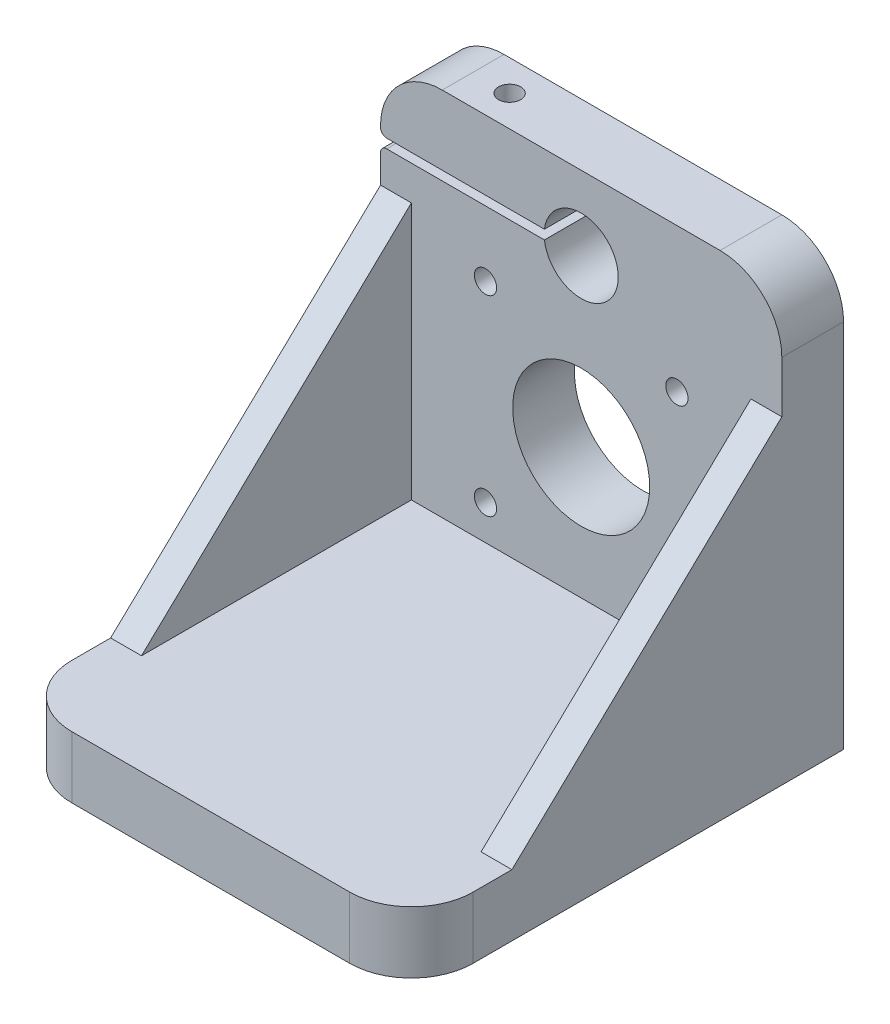
ISO-10303-21;
HEADER;
FILE_DESCRIPTION(('STEP AP214'),'2;1');
FILE_NAME('part.step','',(''),(''),'','','');
FILE_SCHEMA(('AUTOMOTIVE_DESIGN { 1 0 10303 214 1 1 1 1 }'));
ENDSEC;
DATA;
#1=APPLICATION_CONTEXT('core data for automotive mechanical design processes');
#2=APPLICATION_PROTOCOL_DEFINITION('international standard','automotive_design',2000,#1);
#3=PRODUCT_CONTEXT('',#1,'mechanical');
#4=PRODUCT('Part','Part','',(#3));
#5=PRODUCT_RELATED_PRODUCT_CATEGORY('part','',(#4));
#6=PRODUCT_DEFINITION_FORMATION('','',#4);
#7=PRODUCT_DEFINITION_CONTEXT('part definition',#1,'design');
#8=PRODUCT_DEFINITION('design','',#6,#7);
#9=PRODUCT_DEFINITION_SHAPE('','',#8);
#10=(LENGTH_UNIT() NAMED_UNIT(*) SI_UNIT(.MILLI.,.METRE.));
#11=(NAMED_UNIT(*) PLANE_ANGLE_UNIT() SI_UNIT($,.RADIAN.));
#12=(NAMED_UNIT(*) SI_UNIT($,.STERADIAN.) SOLID_ANGLE_UNIT());
#13=UNCERTAINTY_MEASURE_WITH_UNIT(LENGTH_MEASURE(1.E-05),#10,'distance_accuracy_value','');
#14=(GEOMETRIC_REPRESENTATION_CONTEXT(3) GLOBAL_UNCERTAINTY_ASSIGNED_CONTEXT((#13)) GLOBAL_UNIT_ASSIGNED_CONTEXT((#10,
#11,#12)) REPRESENTATION_CONTEXT('',''));
#15=CARTESIAN_POINT('',(0.,0.,0.));
#16=DIRECTION('',(0.,0.,1.));
#17=DIRECTION('',(1.,0.,0.));
#18=AXIS2_PLACEMENT_3D('',#15,#16,#17);
#19=CARTESIAN_POINT('',(-15.5,46.65,-35.));
#20=DIRECTION('',(0.,0.,1.));
#21=DIRECTION('',(1.,0.,0.));
#22=AXIS2_PLACEMENT_3D('',#19,#20,#21);
#23=CYLINDRICAL_SURFACE('',#22,1.8);
#24=CARTESIAN_POINT('',(-15.5,46.65,-25.));
#25=DIRECTION('',(0.,0.,1.));
#26=DIRECTION('',(1.,0.,0.));
#27=AXIS2_PLACEMENT_3D('',#24,#25,#26);
#28=CIRCLE('',#27,1.8);
#29=CARTESIAN_POINT('',(-13.7,46.65,-25.));
#30=VERTEX_POINT('',#29);
#31=EDGE_CURVE('E360',#30,#30,#28,.T.);
#32=ORIENTED_EDGE('',*,*,#31,.T.);
#33=EDGE_LOOP('',(#32));
#34=FACE_BOUND('',#33,.T.);
#35=CARTESIAN_POINT('',(-15.5,46.65,-30.));
#36=DIRECTION('',(0.,0.,-1.));
#37=DIRECTION('',(-1.,0.,0.));
#38=AXIS2_PLACEMENT_3D('',#35,#36,#37);
#39=CIRCLE('',#38,1.8);
#40=CARTESIAN_POINT('',(-17.3,46.65,-30.));
#41=VERTEX_POINT('',#40);
#42=EDGE_CURVE('E42',#41,#41,#39,.F.);
#43=ORIENTED_EDGE('',*,*,#42,.F.);
#44=EDGE_LOOP('',(#43));
#45=FACE_BOUND('',#44,.T.);
#46=ADVANCED_FACE('F38',(#34,#45),#23,.F.);
#47=CARTESIAN_POINT('',(15.5,15.65,-35.));
#48=DIRECTION('',(0.,0.,1.));
#49=DIRECTION('',(1.,0.,0.));
#50=AXIS2_PLACEMENT_3D('',#47,#48,#49);
#51=CYLINDRICAL_SURFACE('',#50,1.8);
#52=CARTESIAN_POINT('',(15.5,15.65,-25.));
#53=DIRECTION('',(0.,0.,1.));
#54=DIRECTION('',(1.,0.,0.));
#55=AXIS2_PLACEMENT_3D('',#52,#53,#54);
#56=CIRCLE('',#55,1.8);
#57=CARTESIAN_POINT('',(17.3,15.65,-25.));
#58=VERTEX_POINT('',#57);
#59=EDGE_CURVE('E344',#58,#58,#56,.T.);
#60=ORIENTED_EDGE('',*,*,#59,.T.);
#61=EDGE_LOOP('',(#60));
#62=FACE_BOUND('',#61,.T.);
#63=CARTESIAN_POINT('',(15.5,15.65,-30.));
#64=DIRECTION('',(0.,0.,-1.));
#65=DIRECTION('',(-1.,0.,0.));
#66=AXIS2_PLACEMENT_3D('',#63,#64,#65);
#67=CIRCLE('',#66,1.8);
#68=CARTESIAN_POINT('',(13.7,15.65,-30.));
#69=VERTEX_POINT('',#68);
#70=EDGE_CURVE('E339',#69,#69,#67,.F.);
#71=ORIENTED_EDGE('',*,*,#70,.F.);
#72=EDGE_LOOP('',(#71));
#73=FACE_BOUND('',#72,.T.);
#74=ADVANCED_FACE('F467',(#62,#73),#51,.F.);
#75=CARTESIAN_POINT('',(-15.5,15.65,-35.));
#76=DIRECTION('',(0.,0.,1.));
#77=DIRECTION('',(1.,0.,0.));
#78=AXIS2_PLACEMENT_3D('',#75,#76,#77);
#79=CYLINDRICAL_SURFACE('',#78,1.8);
#80=CARTESIAN_POINT('',(-15.5,15.65,-25.));
#81=DIRECTION('',(0.,0.,1.));
#82=DIRECTION('',(1.,0.,0.));
#83=AXIS2_PLACEMENT_3D('',#80,#81,#82);
#84=CIRCLE('',#83,1.8);
#85=CARTESIAN_POINT('',(-13.7,15.65,-25.));
#86=VERTEX_POINT('',#85);
#87=EDGE_CURVE('E348',#86,#86,#84,.T.);
#88=ORIENTED_EDGE('',*,*,#87,.T.);
#89=EDGE_LOOP('',(#88));
#90=FACE_BOUND('',#89,.T.);
#91=CARTESIAN_POINT('',(-15.5,15.65,-30.));
#92=DIRECTION('',(0.,0.,-1.));
#93=DIRECTION('',(-1.,0.,0.));
#94=AXIS2_PLACEMENT_3D('',#91,#92,#93);
#95=CIRCLE('',#94,1.8);
#96=CARTESIAN_POINT('',(-17.3,15.65,-30.));
#97=VERTEX_POINT('',#96);
#98=EDGE_CURVE('E336',#97,#97,#95,.F.);
#99=ORIENTED_EDGE('',*,*,#98,.F.);
#100=EDGE_LOOP('',(#99));
#101=FACE_BOUND('',#100,.T.);
#102=ADVANCED_FACE('F474',(#90,#101),#79,.F.);
#103=CARTESIAN_POINT('',(15.5,46.65,-35.));
#104=DIRECTION('',(0.,0.,1.));
#105=DIRECTION('',(1.,0.,0.));
#106=AXIS2_PLACEMENT_3D('',#103,#104,#105);
#107=CYLINDRICAL_SURFACE('',#106,1.8);
#108=CARTESIAN_POINT('',(15.5,46.65,-25.));
#109=DIRECTION('',(0.,0.,1.));
#110=DIRECTION('',(1.,0.,0.));
#111=AXIS2_PLACEMENT_3D('',#108,#109,#110);
#112=CIRCLE('',#111,1.8);
#113=CARTESIAN_POINT('',(17.3,46.65,-25.));
#114=VERTEX_POINT('',#113);
#115=EDGE_CURVE('E353',#114,#114,#112,.T.);
#116=ORIENTED_EDGE('',*,*,#115,.T.);
#117=EDGE_LOOP('',(#116));
#118=FACE_BOUND('',#117,.T.);
#119=CARTESIAN_POINT('',(15.5,46.65,-30.));
#120=DIRECTION('',(0.,0.,-1.));
#121=DIRECTION('',(-1.,0.,0.));
#122=AXIS2_PLACEMENT_3D('',#119,#120,#121);
#123=CIRCLE('',#122,1.8);
#124=CARTESIAN_POINT('',(13.7,46.65,-30.));
#125=VERTEX_POINT('',#124);
#126=EDGE_CURVE('E333',#125,#125,#123,.F.);
#127=ORIENTED_EDGE('',*,*,#126,.F.);
#128=EDGE_LOOP('',(#127));
#129=FACE_BOUND('',#128,.T.);
#130=ADVANCED_FACE('F694',(#118,#129),#107,.F.);
#131=CARTESIAN_POINT('',(-32.5,10.,-35.));
#132=DIRECTION('',(1.,0.,0.));
#133=DIRECTION('',(0.,0.,-1.));
#134=AXIS2_PLACEMENT_3D('',#131,#132,#133);
#135=PLANE('',#134);
#136=DIRECTION('',(0.,0.,1.));
#137=VECTOR('',#136,1.);
#138=CARTESIAN_POINT('',(-32.5,60.,-35.));
#139=LINE('',#138,#137);
#140=CARTESIAN_POINT('',(-32.5,60.,-25.));
#141=VERTEX_POINT('',#140);
#142=CARTESIAN_POINT('',(-32.5,60.,-35.));
#143=VERTEX_POINT('',#142);
#144=EDGE_CURVE('E312',#141,#143,#139,.F.);
#145=ORIENTED_EDGE('',*,*,#144,.T.);
#146=DIRECTION('',(0.,-1.,0.));
#147=VECTOR('',#146,1.);
#148=CARTESIAN_POINT('',(-32.5,10.,-35.));
#149=LINE('',#148,#147);
#150=CARTESIAN_POINT('',(-32.5,59.75,-35.));
#151=VERTEX_POINT('',#150);
#152=EDGE_CURVE('E273',#143,#151,#149,.T.);
#153=ORIENTED_EDGE('',*,*,#152,.T.);
#154=DIRECTION('',(0.,0.,1.));
#155=VECTOR('',#154,1.);
#156=CARTESIAN_POINT('',(-32.5,59.75,-35.));
#157=LINE('',#156,#155);
#158=CARTESIAN_POINT('',(-32.5,59.75,-25.));
#159=VERTEX_POINT('',#158);
#160=EDGE_CURVE('E314',#151,#159,#157,.T.);
#161=ORIENTED_EDGE('',*,*,#160,.T.);
#162=DIRECTION('',(0.,-1.,0.));
#163=VECTOR('',#162,1.);
#164=CARTESIAN_POINT('',(-32.5,70.,-25.));
#165=LINE('',#164,#163);
#166=EDGE_CURVE('E251',#141,#159,#165,.T.);
#167=ORIENTED_EDGE('',*,*,#166,.F.);
#168=EDGE_LOOP('',(#145,#153,#161,#167));
#169=FACE_BOUND('',#168,.T.);
#170=ADVANCED_FACE('F431',(#169),#135,.F.);
#171=CARTESIAN_POINT('',(0.,10.,0.));
#172=DIRECTION('',(0.,-1.,0.));
#173=DIRECTION('',(0.,0.,-1.));
#174=AXIS2_PLACEMENT_3D('',#171,#172,#173);
#175=PLANE('',#174);
#176=DIRECTION('',(0.,0.,1.));
#177=VECTOR('',#176,1.);
#178=CARTESIAN_POINT('',(32.5,10.,-35.));
#179=LINE('',#178,#177);
#180=CARTESIAN_POINT('',(32.5,10.,18.7176431970407));
#181=VERTEX_POINT('',#180);
#182=CARTESIAN_POINT('',(32.5,10.,25.));
#183=VERTEX_POINT('',#182);
#184=EDGE_CURVE('E60',#181,#183,#179,.T.);
#185=ORIENTED_EDGE('',*,*,#184,.F.);
#186=DIRECTION('',(-1.,0.,0.));
#187=VECTOR('',#186,1.);
#188=CARTESIAN_POINT('',(0.,10.,18.7176431970407));
#189=LINE('',#188,#187);
#190=CARTESIAN_POINT('',(27.5,10.,18.7176431970407));
#191=VERTEX_POINT('',#190);
#192=EDGE_CURVE('E55',#181,#191,#189,.T.);
#193=ORIENTED_EDGE('',*,*,#192,.T.);
#194=DIRECTION('',(0.,0.,1.));
#195=VECTOR('',#194,1.);
#196=CARTESIAN_POINT('',(27.5,10.,0.));
#197=LINE('',#196,#195);
#198=CARTESIAN_POINT('',(27.5,10.,-25.));
#199=VERTEX_POINT('',#198);
#200=EDGE_CURVE('E184',#199,#191,#197,.T.);
#201=ORIENTED_EDGE('',*,*,#200,.F.);
#202=DIRECTION('',(1.,0.,0.));
#203=VECTOR('',#202,1.);
#204=CARTESIAN_POINT('',(-32.5,10.,-25.));
#205=LINE('',#204,#203);
#206=CARTESIAN_POINT('',(-27.5,10.,-25.));
#207=VERTEX_POINT('',#206);
#208=EDGE_CURVE('E175',#207,#199,#205,.T.);
#209=ORIENTED_EDGE('',*,*,#208,.F.);
#210=DIRECTION('',(0.,0.,-1.));
#211=VECTOR('',#210,1.);
#212=CARTESIAN_POINT('',(-27.5,10.,0.));
#213=LINE('',#212,#211);
#214=CARTESIAN_POINT('',(-27.5,10.,18.7176431970407));
#215=VERTEX_POINT('',#214);
#216=EDGE_CURVE('E216',#215,#207,#213,.T.);
#217=ORIENTED_EDGE('',*,*,#216,.F.);
#218=DIRECTION('',(1.,0.,0.));
#219=VECTOR('',#218,1.);
#220=CARTESIAN_POINT('',(0.,10.,18.7176431970407));
#221=LINE('',#220,#219);
#222=CARTESIAN_POINT('',(-32.5,10.,18.7176431970407));
#223=VERTEX_POINT('',#222);
#224=EDGE_CURVE('E213',#215,#223,#221,.F.);
#225=ORIENTED_EDGE('',*,*,#224,.T.);
#226=DIRECTION('',(0.,0.,1.));
#227=VECTOR('',#226,1.);
#228=CARTESIAN_POINT('',(-32.5,10.,-35.));
#229=LINE('',#228,#227);
#230=CARTESIAN_POINT('',(-32.5,10.,25.));
#231=VERTEX_POINT('',#230);
#232=EDGE_CURVE('E260',#223,#231,#229,.T.);
#233=ORIENTED_EDGE('',*,*,#232,.T.);
#234=CARTESIAN_POINT('',(-22.5,10.,25.));
#235=DIRECTION('',(0.,-1.,0.));
#236=DIRECTION('',(0.,0.,-1.));
#237=AXIS2_PLACEMENT_3D('',#234,#235,#236);
#238=CIRCLE('',#237,10.);
#239=CARTESIAN_POINT('',(-22.5,10.,35.));
#240=VERTEX_POINT('',#239);
#241=EDGE_CURVE('E290',#231,#240,#238,.F.);
#242=ORIENTED_EDGE('',*,*,#241,.T.);
#243=DIRECTION('',(1.,0.,0.));
#244=VECTOR('',#243,1.);
#245=CARTESIAN_POINT('',(-32.5,10.,35.));
#246=LINE('',#245,#244);
#247=CARTESIAN_POINT('',(22.5,10.,35.));
#248=VERTEX_POINT('',#247);
#249=EDGE_CURVE('E255',#240,#248,#246,.T.);
#250=ORIENTED_EDGE('',*,*,#249,.T.);
#251=CARTESIAN_POINT('',(22.5,10.,25.));
#252=DIRECTION('',(0.,-1.,0.));
#253=DIRECTION('',(0.,0.,-1.));
#254=AXIS2_PLACEMENT_3D('',#251,#252,#253);
#255=CIRCLE('',#254,10.);
#256=EDGE_CURVE('E292',#248,#183,#255,.F.);
#257=ORIENTED_EDGE('',*,*,#256,.T.);
#258=EDGE_LOOP('',(#185,#193,#201,#209,#217,#225,#233,#242,#250,#257));
#259=FACE_BOUND('',#258,.T.);
#260=ADVANCED_FACE('F185',(#259),#175,.F.);
#261=CARTESIAN_POINT('',(-32.5,10.,35.));
#262=DIRECTION('',(0.,0.,-1.));
#263=DIRECTION('',(-1.,0.,0.));
#264=AXIS2_PLACEMENT_3D('',#261,#262,#263);
#265=PLANE('',#264);
#266=DIRECTION('',(1.,0.,0.));
#267=VECTOR('',#266,1.);
#268=CARTESIAN_POINT('',(-32.5,0.,35.));
#269=LINE('',#268,#267);
#270=CARTESIAN_POINT('',(-22.5,0.,35.));
#271=VERTEX_POINT('',#270);
#272=CARTESIAN_POINT('',(22.5,0.,35.));
#273=VERTEX_POINT('',#272);
#274=EDGE_CURVE('E254',#271,#273,#269,.T.);
#275=ORIENTED_EDGE('',*,*,#274,.T.);
#276=DIRECTION('',(0.,-1.,0.));
#277=VECTOR('',#276,1.);
#278=CARTESIAN_POINT('',(22.5,10.,35.));
#279=LINE('',#278,#277);
#280=EDGE_CURVE('E288',#273,#248,#279,.F.);
#281=ORIENTED_EDGE('',*,*,#280,.T.);
#282=ORIENTED_EDGE('',*,*,#249,.F.);
#283=DIRECTION('',(0.,-1.,0.));
#284=VECTOR('',#283,1.);
#285=CARTESIAN_POINT('',(-22.5,10.,35.));
#286=LINE('',#285,#284);
#287=EDGE_CURVE('E285',#240,#271,#286,.T.);
#288=ORIENTED_EDGE('',*,*,#287,.T.);
#289=EDGE_LOOP('',(#275,#281,#282,#288));
#290=FACE_BOUND('',#289,.T.);
#291=ADVANCED_FACE('F454',(#290),#265,.F.);
#292=CARTESIAN_POINT('',(32.5,10.,-35.));
#293=DIRECTION('',(1.,0.,0.));
#294=DIRECTION('',(0.,0.,-1.));
#295=AXIS2_PLACEMENT_3D('',#292,#293,#294);
#296=PLANE('',#295);
#297=DIRECTION('',(0.,-0.689915950609972,0.723889481270407));
#298=VECTOR('',#297,1.);
#299=CARTESIAN_POINT('',(32.5,51.6658898148117,-25.));
#300=LINE('',#299,#298);
#301=CARTESIAN_POINT('',(32.5,51.6658898148117,-25.));
#302=VERTEX_POINT('',#301);
#303=EDGE_CURVE('E194',#302,#181,#300,.T.);
#304=ORIENTED_EDGE('',*,*,#303,.T.);
#305=ORIENTED_EDGE('',*,*,#184,.T.);
#306=DIRECTION('',(0.,-1.,0.));
#307=VECTOR('',#306,1.);
#308=CARTESIAN_POINT('',(32.5,0.,25.));
#309=LINE('',#308,#307);
#310=CARTESIAN_POINT('',(32.5,0.,25.));
#311=VERTEX_POINT('',#310);
#312=EDGE_CURVE('E279',#183,#311,#309,.T.);
#313=ORIENTED_EDGE('',*,*,#312,.T.);
#314=DIRECTION('',(0.,0.,1.));
#315=VECTOR('',#314,1.);
#316=CARTESIAN_POINT('',(32.5,0.,-35.));
#317=LINE('',#316,#315);
#318=CARTESIAN_POINT('',(32.5,0.,-35.));
#319=VERTEX_POINT('',#318);
#320=EDGE_CURVE('E266',#319,#311,#317,.T.);
#321=ORIENTED_EDGE('',*,*,#320,.F.);
#322=DIRECTION('',(0.,-1.,0.));
#323=VECTOR('',#322,1.);
#324=CARTESIAN_POINT('',(32.5,10.,-35.));
#325=LINE('',#324,#323);
#326=CARTESIAN_POINT('',(32.5,60.,-35.));
#327=VERTEX_POINT('',#326);
#328=EDGE_CURVE('E276',#327,#319,#325,.T.);
#329=ORIENTED_EDGE('',*,*,#328,.F.);
#330=DIRECTION('',(0.,0.,-1.));
#331=VECTOR('',#330,1.);
#332=CARTESIAN_POINT('',(32.5,60.,-35.));
#333=LINE('',#332,#331);
#334=CARTESIAN_POINT('',(32.5,60.,-25.));
#335=VERTEX_POINT('',#334);
#336=EDGE_CURVE('E306',#327,#335,#333,.F.);
#337=ORIENTED_EDGE('',*,*,#336,.T.);
#338=DIRECTION('',(0.,-1.,0.));
#339=VECTOR('',#338,1.);
#340=CARTESIAN_POINT('',(32.5,70.,-25.));
#341=LINE('',#340,#339);
#342=EDGE_CURVE('E246',#335,#302,#341,.T.);
#343=ORIENTED_EDGE('',*,*,#342,.T.);
#344=EDGE_LOOP('',(#304,#305,#313,#321,#329,#337,#343));
#345=FACE_BOUND('',#344,.T.);
#346=ADVANCED_FACE('F393',(#345),#296,.T.);
#347=CARTESIAN_POINT('',(-32.5,10.,-35.));
#348=DIRECTION('',(0.,0.,-1.));
#349=DIRECTION('',(-1.,0.,0.));
#350=AXIS2_PLACEMENT_3D('',#347,#348,#349);
#351=PLANE('',#350);
#352=CARTESIAN_POINT('',(15.5,15.65,-35.));
#353=DIRECTION('',(0.,0.,-1.));
#354=DIRECTION('',(-1.,0.,0.));
#355=AXIS2_PLACEMENT_3D('',#352,#353,#354);
#356=CIRCLE('',#355,3.);
#357=CARTESIAN_POINT('',(12.5,15.65,-35.));
#358=VERTEX_POINT('',#357);
#359=EDGE_CURVE('E841',#358,#358,#356,.T.);
#360=ORIENTED_EDGE('',*,*,#359,.F.);
#361=EDGE_LOOP('',(#360));
#362=FACE_BOUND('',#361,.T.);
#363=CARTESIAN_POINT('',(-15.5,15.65,-35.));
#364=DIRECTION('',(0.,0.,-1.));
#365=DIRECTION('',(-1.,0.,0.));
#366=AXIS2_PLACEMENT_3D('',#363,#364,#365);
#367=CIRCLE('',#366,3.);
#368=CARTESIAN_POINT('',(-18.5,15.65,-35.));
#369=VERTEX_POINT('',#368);
#370=EDGE_CURVE('E833',#369,#369,#367,.T.);
#371=ORIENTED_EDGE('',*,*,#370,.F.);
#372=EDGE_LOOP('',(#371));
#373=FACE_BOUND('',#372,.T.);
#374=CARTESIAN_POINT('',(-15.5,46.65,-35.));
#375=DIRECTION('',(0.,0.,-1.));
#376=DIRECTION('',(-1.,0.,0.));
#377=AXIS2_PLACEMENT_3D('',#374,#375,#376);
#378=CIRCLE('',#377,3.);
#379=CARTESIAN_POINT('',(-18.5,46.65,-35.));
#380=VERTEX_POINT('',#379);
#381=EDGE_CURVE('E829',#380,#380,#378,.T.);
#382=ORIENTED_EDGE('',*,*,#381,.F.);
#383=EDGE_LOOP('',(#382));
#384=FACE_BOUND('',#383,.T.);
#385=CARTESIAN_POINT('',(15.5,46.65,-35.));
#386=DIRECTION('',(0.,0.,-1.));
#387=DIRECTION('',(-1.,0.,0.));
#388=AXIS2_PLACEMENT_3D('',#385,#386,#387);
#389=CIRCLE('',#388,3.);
#390=CARTESIAN_POINT('',(12.5,46.65,-35.));
#391=VERTEX_POINT('',#390);
#392=EDGE_CURVE('E357',#391,#391,#389,.T.);
#393=ORIENTED_EDGE('',*,*,#392,.F.);
#394=EDGE_LOOP('',(#393));
#395=FACE_BOUND('',#394,.T.);
#396=CARTESIAN_POINT('',(22.5,60.,-35.));
#397=DIRECTION('',(0.,0.,-1.));
#398=DIRECTION('',(-1.,0.,0.));
#399=AXIS2_PLACEMENT_3D('',#396,#397,#398);
#400=CIRCLE('',#399,10.);
#401=CARTESIAN_POINT('',(22.5,70.,-35.));
#402=VERTEX_POINT('',#401);
#403=EDGE_CURVE('E304',#402,#327,#400,.T.);
#404=ORIENTED_EDGE('',*,*,#403,.T.);
#405=ORIENTED_EDGE('',*,*,#328,.T.);
#406=DIRECTION('',(1.,0.,0.));
#407=VECTOR('',#406,1.);
#408=CARTESIAN_POINT('',(-32.5,0.,-35.));
#409=LINE('',#408,#407);
#410=CARTESIAN_POINT('',(-32.5,0.,-35.));
#411=VERTEX_POINT('',#410);
#412=EDGE_CURVE('E269',#411,#319,#409,.T.);
#413=ORIENTED_EDGE('',*,*,#412,.F.);
#414=CARTESIAN_POINT('',(-32.5,56.25,-35.));
#415=VERTEX_POINT('',#414);
#416=EDGE_CURVE('E263',#415,#411,#149,.T.);
#417=ORIENTED_EDGE('',*,*,#416,.F.);
#418=CARTESIAN_POINT('',(-31.5,56.25,-35.));
#419=DIRECTION('',(0.,0.,-1.));
#420=DIRECTION('',(-1.,0.,0.));
#421=AXIS2_PLACEMENT_3D('',#418,#419,#420);
#422=CIRCLE('',#421,1.);
#423=CARTESIAN_POINT('',(-31.5,57.25,-35.));
#424=VERTEX_POINT('',#423);
#425=EDGE_CURVE('E47',#415,#424,#422,.T.);
#426=ORIENTED_EDGE('',*,*,#425,.T.);
#427=DIRECTION('',(-1.,0.,0.));
#428=VECTOR('',#427,1.);
#429=CARTESIAN_POINT('',(-32.5,57.25,-35.));
#430=LINE('',#429,#428);
#431=CARTESIAN_POINT('',(-5.95294044989534,57.25,-35.));
#432=VERTEX_POINT('',#431);
#433=EDGE_CURVE('E235',#432,#424,#430,.T.);
#434=ORIENTED_EDGE('',*,*,#433,.F.);
#435=CARTESIAN_POINT('',(0.,58.,-35.));
#436=DIRECTION('',(0.,0.,-1.));
#437=DIRECTION('',(-1.,0.,0.));
#438=AXIS2_PLACEMENT_3D('',#435,#436,#437);
#439=CIRCLE('',#438,6.);
#440=CARTESIAN_POINT('',(-5.95294044989534,58.75,-35.));
#441=VERTEX_POINT('',#440);
#442=EDGE_CURVE('E239',#441,#432,#439,.T.);
#443=ORIENTED_EDGE('',*,*,#442,.F.);
#444=DIRECTION('',(1.,0.,0.));
#445=VECTOR('',#444,1.);
#446=CARTESIAN_POINT('',(-32.5,58.75,-35.));
#447=LINE('',#446,#445);
#448=CARTESIAN_POINT('',(-31.5,58.75,-35.));
#449=VERTEX_POINT('',#448);
#450=EDGE_CURVE('E182',#449,#441,#447,.T.);
#451=ORIENTED_EDGE('',*,*,#450,.F.);
#452=CARTESIAN_POINT('',(-31.5,59.75,-35.));
#453=DIRECTION('',(0.,0.,-1.));
#454=DIRECTION('',(-1.,0.,0.));
#455=AXIS2_PLACEMENT_3D('',#452,#453,#454);
#456=CIRCLE('',#455,1.);
#457=EDGE_CURVE('E320',#449,#151,#456,.T.);
#458=ORIENTED_EDGE('',*,*,#457,.T.);
#459=ORIENTED_EDGE('',*,*,#152,.F.);
#460=CARTESIAN_POINT('',(-22.5,60.,-35.));
#461=DIRECTION('',(0.,0.,-1.));
#462=DIRECTION('',(-1.,0.,0.));
#463=AXIS2_PLACEMENT_3D('',#460,#461,#462);
#464=CIRCLE('',#463,10.);
#465=CARTESIAN_POINT('',(-22.5,70.,-35.));
#466=VERTEX_POINT('',#465);
#467=EDGE_CURVE('E302',#143,#466,#464,.T.);
#468=ORIENTED_EDGE('',*,*,#467,.T.);
#469=DIRECTION('',(-1.,0.,0.));
#470=VECTOR('',#469,1.);
#471=CARTESIAN_POINT('',(-32.5,70.,-35.));
#472=LINE('',#471,#470);
#473=EDGE_CURVE('E244',#402,#466,#472,.T.);
#474=ORIENTED_EDGE('',*,*,#473,.F.);
#475=EDGE_LOOP('',(#404,#405,#413,#417,#426,#434,#443,#451,#458,#459,#468,#474));
#476=FACE_BOUND('',#475,.T.);
#477=CARTESIAN_POINT('',(0.,31.15,-35.));
#478=DIRECTION('',(0.,0.,-1.));
#479=DIRECTION('',(-1.,0.,0.));
#480=AXIS2_PLACEMENT_3D('',#477,#478,#479);
#481=CIRCLE('',#480,11.1);
#482=CARTESIAN_POINT('',(11.1,31.15,-35.));
#483=VERTEX_POINT('',#482);
#484=EDGE_CURVE('E221',#483,#483,#481,.T.);
#485=ORIENTED_EDGE('',*,*,#484,.F.);
#486=EDGE_LOOP('',(#485));
#487=FACE_BOUND('',#486,.T.);
#488=ADVANCED_FACE('F388',(#362,#373,#384,#395,#476,#487),#351,.T.);
#489=ORIENTED_EDGE('',*,*,#232,.F.);
#490=DIRECTION('',(0.,-0.689915950609972,0.723889481270407));
#491=VECTOR('',#490,1.);
#492=CARTESIAN_POINT('',(-32.5,51.6658898148117,-25.));
#493=LINE('',#492,#491);
#494=CARTESIAN_POINT('',(-32.5,51.6658898148117,-25.));
#495=VERTEX_POINT('',#494);
#496=EDGE_CURVE('E206',#495,#223,#493,.T.);
#497=ORIENTED_EDGE('',*,*,#496,.F.);
#498=CARTESIAN_POINT('',(-32.5,56.25,-25.));
#499=VERTEX_POINT('',#498);
#500=EDGE_CURVE('E250',#499,#495,#165,.T.);
#501=ORIENTED_EDGE('',*,*,#500,.F.);
#502=DIRECTION('',(0.,0.,1.));
#503=VECTOR('',#502,1.);
#504=CARTESIAN_POINT('',(-32.5,56.25,-35.));
#505=LINE('',#504,#503);
#506=EDGE_CURVE('E326',#499,#415,#505,.F.);
#507=ORIENTED_EDGE('',*,*,#506,.T.);
#508=ORIENTED_EDGE('',*,*,#416,.T.);
#509=DIRECTION('',(0.,0.,1.));
#510=VECTOR('',#509,1.);
#511=CARTESIAN_POINT('',(-32.5,0.,-35.));
#512=LINE('',#511,#510);
#513=CARTESIAN_POINT('',(-32.5,0.,25.));
#514=VERTEX_POINT('',#513);
#515=EDGE_CURVE('E258',#411,#514,#512,.T.);
#516=ORIENTED_EDGE('',*,*,#515,.T.);
#517=DIRECTION('',(0.,-1.,0.));
#518=VECTOR('',#517,1.);
#519=CARTESIAN_POINT('',(-32.5,10.,25.));
#520=LINE('',#519,#518);
#521=EDGE_CURVE('E294',#514,#231,#520,.F.);
#522=ORIENTED_EDGE('',*,*,#521,.T.);
#523=EDGE_LOOP('',(#489,#497,#501,#507,#508,#516,#522));
#524=FACE_BOUND('',#523,.T.);
#525=ADVANCED_FACE('F440',(#524),#135,.F.);
#526=CARTESIAN_POINT('',(0.,0.,0.));
#527=DIRECTION('',(0.,-1.,0.));
#528=DIRECTION('',(0.,0.,-1.));
#529=AXIS2_PLACEMENT_3D('',#526,#527,#528);
#530=PLANE('',#529);
#531=CARTESIAN_POINT('',(22.5,0.,25.));
#532=DIRECTION('',(0.,-1.,0.));
#533=DIRECTION('',(0.,0.,-1.));
#534=AXIS2_PLACEMENT_3D('',#531,#532,#533);
#535=CIRCLE('',#534,10.);
#536=EDGE_CURVE('E283',#311,#273,#535,.T.);
#537=ORIENTED_EDGE('',*,*,#536,.T.);
#538=ORIENTED_EDGE('',*,*,#274,.F.);
#539=CARTESIAN_POINT('',(-22.5,0.,25.));
#540=DIRECTION('',(0.,-1.,0.));
#541=DIRECTION('',(0.,0.,-1.));
#542=AXIS2_PLACEMENT_3D('',#539,#540,#541);
#543=CIRCLE('',#542,10.);
#544=EDGE_CURVE('E281',#271,#514,#543,.T.);
#545=ORIENTED_EDGE('',*,*,#544,.T.);
#546=ORIENTED_EDGE('',*,*,#515,.F.);
#547=ORIENTED_EDGE('',*,*,#412,.T.);
#548=ORIENTED_EDGE('',*,*,#320,.T.);
#549=EDGE_LOOP('',(#537,#538,#545,#546,#547,#548));
#550=FACE_BOUND('',#549,.T.);
#551=ADVANCED_FACE('F398',(#550),#530,.T.);
#552=CARTESIAN_POINT('',(-32.5,70.,-25.));
#553=DIRECTION('',(0.,0.,-1.));
#554=DIRECTION('',(-1.,0.,0.));
#555=AXIS2_PLACEMENT_3D('',#552,#553,#554);
#556=PLANE('',#555);
#557=ORIENTED_EDGE('',*,*,#115,.F.);
#558=EDGE_LOOP('',(#557));
#559=FACE_BOUND('',#558,.T.);
#560=ORIENTED_EDGE('',*,*,#87,.F.);
#561=EDGE_LOOP('',(#560));
#562=FACE_BOUND('',#561,.T.);
#563=ORIENTED_EDGE('',*,*,#59,.F.);
#564=EDGE_LOOP('',(#563));
#565=FACE_BOUND('',#564,.T.);
#566=ORIENTED_EDGE('',*,*,#31,.F.);
#567=EDGE_LOOP('',(#566));
#568=FACE_BOUND('',#567,.T.);
#569=CARTESIAN_POINT('',(0.,31.15,-25.));
#570=DIRECTION('',(0.,0.,1.));
#571=DIRECTION('',(1.,0.,0.));
#572=AXIS2_PLACEMENT_3D('',#569,#570,#571);
#573=CIRCLE('',#572,11.1);
#574=CARTESIAN_POINT('',(11.1,31.15,-25.));
#575=VERTEX_POINT('',#574);
#576=EDGE_CURVE('E218',#575,#575,#573,.T.);
#577=ORIENTED_EDGE('',*,*,#576,.F.);
#578=EDGE_LOOP('',(#577));
#579=FACE_BOUND('',#578,.T.);
#580=DIRECTION('',(0.,-1.,0.));
#581=VECTOR('',#580,1.);
#582=CARTESIAN_POINT('',(27.5,70.,-25.));
#583=LINE('',#582,#581);
#584=CARTESIAN_POINT('',(27.5,51.6658898148117,-25.));
#585=VERTEX_POINT('',#584);
#586=EDGE_CURVE('E11',#585,#199,#583,.T.);
#587=ORIENTED_EDGE('',*,*,#586,.F.);
#588=DIRECTION('',(1.,0.,0.));
#589=VECTOR('',#588,1.);
#590=CARTESIAN_POINT('',(-32.5,51.6658898148117,-25.));
#591=LINE('',#590,#589);
#592=EDGE_CURVE('E198',#585,#302,#591,.T.);
#593=ORIENTED_EDGE('',*,*,#592,.T.);
#594=ORIENTED_EDGE('',*,*,#342,.F.);
#595=CARTESIAN_POINT('',(22.5,60.,-25.));
#596=DIRECTION('',(0.,0.,-1.));
#597=DIRECTION('',(-1.,0.,0.));
#598=AXIS2_PLACEMENT_3D('',#595,#596,#597);
#599=CIRCLE('',#598,10.);
#600=CARTESIAN_POINT('',(22.5,70.,-25.));
#601=VERTEX_POINT('',#600);
#602=EDGE_CURVE('E310',#335,#601,#599,.F.);
#603=ORIENTED_EDGE('',*,*,#602,.T.);
#604=DIRECTION('',(1.,0.,0.));
#605=VECTOR('',#604,1.);
#606=CARTESIAN_POINT('',(-32.5,70.,-25.));
#607=LINE('',#606,#605);
#608=CARTESIAN_POINT('',(-22.5,70.,-25.));
#609=VERTEX_POINT('',#608);
#610=EDGE_CURVE('E181',#609,#601,#607,.T.);
#611=ORIENTED_EDGE('',*,*,#610,.F.);
#612=CARTESIAN_POINT('',(-22.5,60.,-25.));
#613=DIRECTION('',(0.,0.,-1.));
#614=DIRECTION('',(-1.,0.,0.));
#615=AXIS2_PLACEMENT_3D('',#612,#613,#614);
#616=CIRCLE('',#615,10.);
#617=EDGE_CURVE('E308',#609,#141,#616,.F.);
#618=ORIENTED_EDGE('',*,*,#617,.T.);
#619=ORIENTED_EDGE('',*,*,#166,.T.);
#620=CARTESIAN_POINT('',(-31.5,59.75,-25.));
#621=DIRECTION('',(0.,0.,-1.));
#622=DIRECTION('',(-1.,0.,0.));
#623=AXIS2_PLACEMENT_3D('',#620,#621,#622);
#624=CIRCLE('',#623,1.);
#625=CARTESIAN_POINT('',(-31.5,58.75,-25.));
#626=VERTEX_POINT('',#625);
#627=EDGE_CURVE('E316',#159,#626,#624,.F.);
#628=ORIENTED_EDGE('',*,*,#627,.T.);
#629=DIRECTION('',(-1.,0.,0.));
#630=VECTOR('',#629,1.);
#631=CARTESIAN_POINT('',(-5.95294044989534,58.75,-25.));
#632=LINE('',#631,#630);
#633=CARTESIAN_POINT('',(-5.95294044989534,58.75,-25.));
#634=VERTEX_POINT('',#633);
#635=EDGE_CURVE('E229',#634,#626,#632,.T.);
#636=ORIENTED_EDGE('',*,*,#635,.F.);
#637=CARTESIAN_POINT('',(0.,58.,-25.));
#638=DIRECTION('',(0.,0.,1.));
#639=DIRECTION('',(1.,0.,0.));
#640=AXIS2_PLACEMENT_3D('',#637,#638,#639);
#641=CIRCLE('',#640,6.);
#642=CARTESIAN_POINT('',(-5.95294044989534,57.25,-25.));
#643=VERTEX_POINT('',#642);
#644=EDGE_CURVE('E226',#643,#634,#641,.T.);
#645=ORIENTED_EDGE('',*,*,#644,.F.);
#646=DIRECTION('',(1.,0.,0.));
#647=VECTOR('',#646,1.);
#648=CARTESIAN_POINT('',(-5.95294044989534,57.25,-25.));
#649=LINE('',#648,#647);
#650=CARTESIAN_POINT('',(-31.5,57.25,-25.));
#651=VERTEX_POINT('',#650);
#652=EDGE_CURVE('E224',#651,#643,#649,.T.);
#653=ORIENTED_EDGE('',*,*,#652,.F.);
#654=CARTESIAN_POINT('',(-31.5,56.25,-25.));
#655=DIRECTION('',(0.,0.,-1.));
#656=DIRECTION('',(-1.,0.,0.));
#657=AXIS2_PLACEMENT_3D('',#654,#655,#656);
#658=CIRCLE('',#657,1.);
#659=EDGE_CURVE('E324',#651,#499,#658,.F.);
#660=ORIENTED_EDGE('',*,*,#659,.T.);
#661=ORIENTED_EDGE('',*,*,#500,.T.);
#662=DIRECTION('',(-1.,0.,0.));
#663=VECTOR('',#662,1.);
#664=CARTESIAN_POINT('',(-32.5,51.6658898148117,-25.));
#665=LINE('',#664,#663);
#666=CARTESIAN_POINT('',(-27.5,51.6658898148117,-25.));
#667=VERTEX_POINT('',#666);
#668=EDGE_CURVE('E209',#495,#667,#665,.F.);
#669=ORIENTED_EDGE('',*,*,#668,.T.);
#670=DIRECTION('',(0.,1.,0.));
#671=VECTOR('',#670,1.);
#672=CARTESIAN_POINT('',(-27.5,70.,-25.));
#673=LINE('',#672,#671);
#674=EDGE_CURVE('E179',#207,#667,#673,.T.);
#675=ORIENTED_EDGE('',*,*,#674,.F.);
#676=ORIENTED_EDGE('',*,*,#208,.T.);
#677=EDGE_LOOP('',(#587,#593,#594,#603,#611,#618,#619,#628,#636,#645,#653,#660,#661,#669,#675,#676));
#678=FACE_BOUND('',#677,.T.);
#679=ADVANCED_FACE('F176',(#559,#562,#565,#568,#579,#678),#556,.F.);
#680=CARTESIAN_POINT('',(0.,70.,0.));
#681=DIRECTION('',(0.,1.,0.));
#682=DIRECTION('',(0.,0.,1.));
#683=AXIS2_PLACEMENT_3D('',#680,#681,#682);
#684=PLANE('',#683);
#685=CARTESIAN_POINT('',(-16.5972942250008,70.,-30.));
#686=DIRECTION('',(0.,1.,0.));
#687=DIRECTION('',(0.,0.,1.));
#688=AXIS2_PLACEMENT_3D('',#685,#686,#687);
#689=CIRCLE('',#688,1.8);
#690=CARTESIAN_POINT('',(-16.5972942250008,70.,-28.2));
#691=VERTEX_POINT('',#690);
#692=EDGE_CURVE('E364',#691,#691,#689,.T.);
#693=ORIENTED_EDGE('',*,*,#692,.F.);
#694=EDGE_LOOP('',(#693));
#695=FACE_BOUND('',#694,.T.);
#696=ORIENTED_EDGE('',*,*,#610,.T.);
#697=DIRECTION('',(0.,0.,-1.));
#698=VECTOR('',#697,1.);
#699=CARTESIAN_POINT('',(22.5,70.,0.));
#700=LINE('',#699,#698);
#701=EDGE_CURVE('E299',#601,#402,#700,.T.);
#702=ORIENTED_EDGE('',*,*,#701,.T.);
#703=ORIENTED_EDGE('',*,*,#473,.T.);
#704=DIRECTION('',(0.,0.,1.));
#705=VECTOR('',#704,1.);
#706=CARTESIAN_POINT('',(-22.5,70.,-25.));
#707=LINE('',#706,#705);
#708=EDGE_CURVE('E296',#466,#609,#707,.T.);
#709=ORIENTED_EDGE('',*,*,#708,.T.);
#710=EDGE_LOOP('',(#696,#702,#703,#709));
#711=FACE_BOUND('',#710,.T.);
#712=ADVANCED_FACE('F373',(#695,#711),#684,.T.);
#713=CARTESIAN_POINT('',(22.5,10.,25.));
#714=DIRECTION('',(0.,1.,0.));
#715=DIRECTION('',(0.,0.,1.));
#716=AXIS2_PLACEMENT_3D('',#713,#714,#715);
#717=CYLINDRICAL_SURFACE('',#716,10.);
#718=ORIENTED_EDGE('',*,*,#280,.F.);
#719=ORIENTED_EDGE('',*,*,#536,.F.);
#720=ORIENTED_EDGE('',*,*,#312,.F.);
#721=ORIENTED_EDGE('',*,*,#256,.F.);
#722=EDGE_LOOP('',(#718,#719,#720,#721));
#723=FACE_BOUND('',#722,.T.);
#724=ADVANCED_FACE('F376',(#723),#717,.T.);
#725=CARTESIAN_POINT('',(-22.5,10.,25.));
#726=DIRECTION('',(0.,-1.,0.));
#727=DIRECTION('',(0.,0.,-1.));
#728=AXIS2_PLACEMENT_3D('',#725,#726,#727);
#729=CYLINDRICAL_SURFACE('',#728,10.);
#730=ORIENTED_EDGE('',*,*,#241,.F.);
#731=ORIENTED_EDGE('',*,*,#521,.F.);
#732=ORIENTED_EDGE('',*,*,#544,.F.);
#733=ORIENTED_EDGE('',*,*,#287,.F.);
#734=EDGE_LOOP('',(#730,#731,#732,#733));
#735=FACE_BOUND('',#734,.T.);
#736=ADVANCED_FACE('F452',(#735),#729,.T.);
#737=CARTESIAN_POINT('',(-5.95294044989534,58.75,-85.));
#738=DIRECTION('',(0.,1.,0.));
#739=DIRECTION('',(-1.,0.,0.));
#740=AXIS2_PLACEMENT_3D('',#737,#738,#739);
#741=PLANE('',#740);
#742=CARTESIAN_POINT('',(-16.5972942250008,58.75,-30.));
#743=DIRECTION('',(0.,1.,0.));
#744=DIRECTION('',(-1.,0.,0.));
#745=AXIS2_PLACEMENT_3D('',#742,#743,#744);
#746=CIRCLE('',#745,1.8);
#747=CARTESIAN_POINT('',(-18.3972942250008,58.75,-30.));
#748=VERTEX_POINT('',#747);
#749=EDGE_CURVE('E195',#748,#748,#746,.T.);
#750=ORIENTED_EDGE('',*,*,#749,.T.);
#751=EDGE_LOOP('',(#750));
#752=FACE_BOUND('',#751,.T.);
#753=DIRECTION('',(0.,0.,1.));
#754=VECTOR('',#753,1.);
#755=CARTESIAN_POINT('',(-31.5,58.75,-85.));
#756=LINE('',#755,#754);
#757=EDGE_CURVE('E318',#626,#449,#756,.F.);
#758=ORIENTED_EDGE('',*,*,#757,.T.);
#759=ORIENTED_EDGE('',*,*,#450,.T.);
#760=DIRECTION('',(0.,0.,1.));
#761=VECTOR('',#760,1.);
#762=CARTESIAN_POINT('',(-5.95294044989534,58.75,-85.));
#763=LINE('',#762,#761);
#764=EDGE_CURVE('E233',#441,#634,#763,.T.);
#765=ORIENTED_EDGE('',*,*,#764,.T.);
#766=ORIENTED_EDGE('',*,*,#635,.T.);
#767=EDGE_LOOP('',(#758,#759,#765,#766));
#768=FACE_BOUND('',#767,.T.);
#769=ADVANCED_FACE('F422',(#752,#768),#741,.F.);
#770=CARTESIAN_POINT('',(0.,58.,-85.));
#771=DIRECTION('',(0.,0.,1.));
#772=DIRECTION('',(1.,0.,0.));
#773=AXIS2_PLACEMENT_3D('',#770,#771,#772);
#774=CYLINDRICAL_SURFACE('',#773,6.);
#775=ORIENTED_EDGE('',*,*,#442,.T.);
#776=DIRECTION('',(0.,0.,1.));
#777=VECTOR('',#776,1.);
#778=CARTESIAN_POINT('',(-5.95294044989534,57.25,-85.));
#779=LINE('',#778,#777);
#780=EDGE_CURVE('E232',#432,#643,#779,.T.);
#781=ORIENTED_EDGE('',*,*,#780,.T.);
#782=ORIENTED_EDGE('',*,*,#644,.T.);
#783=ORIENTED_EDGE('',*,*,#764,.F.);
#784=EDGE_LOOP('',(#775,#781,#782,#783));
#785=FACE_BOUND('',#784,.T.);
#786=ADVANCED_FACE('F418',(#785),#774,.F.);
#787=CARTESIAN_POINT('',(-5.95294044989534,57.25,-85.));
#788=DIRECTION('',(0.,-1.,0.));
#789=DIRECTION('',(1.,0.,0.));
#790=AXIS2_PLACEMENT_3D('',#787,#788,#789);
#791=PLANE('',#790);
#792=CARTESIAN_POINT('',(-16.5972942250008,57.25,-30.));
#793=DIRECTION('',(0.,-1.,0.));
#794=DIRECTION('',(1.,0.,0.));
#795=AXIS2_PLACEMENT_3D('',#792,#793,#794);
#796=CIRCLE('',#795,1.8);
#797=CARTESIAN_POINT('',(-14.7972942250008,57.25,-30.));
#798=VERTEX_POINT('',#797);
#799=EDGE_CURVE('E201',#798,#798,#796,.T.);
#800=ORIENTED_EDGE('',*,*,#799,.T.);
#801=EDGE_LOOP('',(#800));
#802=FACE_BOUND('',#801,.T.);
#803=DIRECTION('',(0.,0.,1.));
#804=VECTOR('',#803,1.);
#805=CARTESIAN_POINT('',(-31.5,57.25,-85.));
#806=LINE('',#805,#804);
#807=EDGE_CURVE('E322',#424,#651,#806,.T.);
#808=ORIENTED_EDGE('',*,*,#807,.T.);
#809=ORIENTED_EDGE('',*,*,#652,.T.);
#810=ORIENTED_EDGE('',*,*,#780,.F.);
#811=ORIENTED_EDGE('',*,*,#433,.T.);
#812=EDGE_LOOP('',(#808,#809,#810,#811));
#813=FACE_BOUND('',#812,.T.);
#814=ADVANCED_FACE('F411',(#802,#813),#791,.F.);
#815=CARTESIAN_POINT('',(22.5,60.,0.));
#816=DIRECTION('',(0.,0.,-1.));
#817=DIRECTION('',(-1.,0.,0.));
#818=AXIS2_PLACEMENT_3D('',#815,#816,#817);
#819=CYLINDRICAL_SURFACE('',#818,10.);
#820=ORIENTED_EDGE('',*,*,#602,.F.);
#821=ORIENTED_EDGE('',*,*,#336,.F.);
#822=ORIENTED_EDGE('',*,*,#403,.F.);
#823=ORIENTED_EDGE('',*,*,#701,.F.);
#824=EDGE_LOOP('',(#820,#821,#822,#823));
#825=FACE_BOUND('',#824,.T.);
#826=ADVANCED_FACE('F384',(#825),#819,.T.);
#827=CARTESIAN_POINT('',(-22.5,60.,0.));
#828=DIRECTION('',(0.,0.,-1.));
#829=DIRECTION('',(-1.,0.,0.));
#830=AXIS2_PLACEMENT_3D('',#827,#828,#829);
#831=CYLINDRICAL_SURFACE('',#830,10.);
#832=ORIENTED_EDGE('',*,*,#708,.F.);
#833=ORIENTED_EDGE('',*,*,#467,.F.);
#834=ORIENTED_EDGE('',*,*,#144,.F.);
#835=ORIENTED_EDGE('',*,*,#617,.F.);
#836=EDGE_LOOP('',(#832,#833,#834,#835));
#837=FACE_BOUND('',#836,.T.);
#838=ADVANCED_FACE('F435',(#837),#831,.T.);
#839=CARTESIAN_POINT('',(-31.5,59.75,-35.));
#840=DIRECTION('',(0.,0.,1.));
#841=DIRECTION('',(1.,0.,0.));
#842=AXIS2_PLACEMENT_3D('',#839,#840,#841);
#843=CYLINDRICAL_SURFACE('',#842,1.);
#844=ORIENTED_EDGE('',*,*,#627,.F.);
#845=ORIENTED_EDGE('',*,*,#160,.F.);
#846=ORIENTED_EDGE('',*,*,#457,.F.);
#847=ORIENTED_EDGE('',*,*,#757,.F.);
#848=EDGE_LOOP('',(#844,#845,#846,#847));
#849=FACE_BOUND('',#848,.T.);
#850=ADVANCED_FACE('F426',(#849),#843,.T.);
#851=CARTESIAN_POINT('',(-31.5,56.25,-85.));
#852=DIRECTION('',(0.,0.,1.));
#853=DIRECTION('',(1.,0.,0.));
#854=AXIS2_PLACEMENT_3D('',#851,#852,#853);
#855=CYLINDRICAL_SURFACE('',#854,1.);
#856=ORIENTED_EDGE('',*,*,#659,.F.);
#857=ORIENTED_EDGE('',*,*,#807,.F.);
#858=ORIENTED_EDGE('',*,*,#425,.F.);
#859=ORIENTED_EDGE('',*,*,#506,.F.);
#860=EDGE_LOOP('',(#856,#857,#858,#859));
#861=FACE_BOUND('',#860,.T.);
#862=ADVANCED_FACE('F40',(#861),#855,.T.);
#863=CARTESIAN_POINT('',(0.,31.15,-85.));
#864=DIRECTION('',(0.,0.,1.));
#865=DIRECTION('',(1.,0.,0.));
#866=AXIS2_PLACEMENT_3D('',#863,#864,#865);
#867=CYLINDRICAL_SURFACE('',#866,11.1);
#868=CARTESIAN_POINT('',(11.1,31.15,-35.));
#869=CARTESIAN_POINT('',(11.1,31.15,-34.8958333333333));
#870=CARTESIAN_POINT('',(11.1,31.15,-34.7916666666667));
#871=CARTESIAN_POINT('',(11.1,31.15,-34.5833333333333));
#872=CARTESIAN_POINT('',(11.1,31.15,-34.4791666666667));
#873=CARTESIAN_POINT('',(11.1,31.15,-34.2708333333333));
#874=CARTESIAN_POINT('',(11.1,31.15,-34.1666666666667));
#875=CARTESIAN_POINT('',(11.1,31.15,-33.9583333333333));
#876=CARTESIAN_POINT('',(11.1,31.15,-33.8541666666667));
#877=CARTESIAN_POINT('',(11.1,31.15,-33.6458333333333));
#878=CARTESIAN_POINT('',(11.1,31.15,-33.5416666666667));
#879=CARTESIAN_POINT('',(11.1,31.15,-33.3333333333333));
#880=CARTESIAN_POINT('',(11.1,31.15,-33.2291666666667));
#881=CARTESIAN_POINT('',(11.1,31.15,-33.0208333333333));
#882=CARTESIAN_POINT('',(11.1,31.15,-32.9166666666667));
#883=CARTESIAN_POINT('',(11.1,31.15,-32.7083333333333));
#884=CARTESIAN_POINT('',(11.1,31.15,-32.6041666666667));
#885=CARTESIAN_POINT('',(11.1,31.15,-32.3958333333333));
#886=CARTESIAN_POINT('',(11.1,31.15,-32.2916666666667));
#887=CARTESIAN_POINT('',(11.1,31.15,-32.0833333333333));
#888=CARTESIAN_POINT('',(11.1,31.15,-31.9791666666667));
#889=CARTESIAN_POINT('',(11.1,31.15,-31.7708333333333));
#890=CARTESIAN_POINT('',(11.1,31.15,-31.6666666666667));
#891=CARTESIAN_POINT('',(11.1,31.15,-31.4583333333333));
#892=CARTESIAN_POINT('',(11.1,31.15,-31.3541666666667));
#893=CARTESIAN_POINT('',(11.1,31.15,-31.1458333333333));
#894=CARTESIAN_POINT('',(11.1,31.15,-31.0416666666667));
#895=CARTESIAN_POINT('',(11.1,31.15,-30.8333333333333));
#896=CARTESIAN_POINT('',(11.1,31.15,-30.7291666666667));
#897=CARTESIAN_POINT('',(11.1,31.15,-30.5208333333333));
#898=CARTESIAN_POINT('',(11.1,31.15,-30.4166666666667));
#899=CARTESIAN_POINT('',(11.1,31.15,-30.2083333333333));
#900=CARTESIAN_POINT('',(11.1,31.15,-30.1041666666667));
#901=CARTESIAN_POINT('',(11.1,31.15,-29.8958333333333));
#902=CARTESIAN_POINT('',(11.1,31.15,-29.7916666666667));
#903=CARTESIAN_POINT('',(11.1,31.15,-29.5833333333333));
#904=CARTESIAN_POINT('',(11.1,31.15,-29.4791666666667));
#905=CARTESIAN_POINT('',(11.1,31.15,-29.2708333333333));
#906=CARTESIAN_POINT('',(11.1,31.15,-29.1666666666667));
#907=CARTESIAN_POINT('',(11.1,31.15,-28.9583333333333));
#908=CARTESIAN_POINT('',(11.1,31.15,-28.8541666666667));
#909=CARTESIAN_POINT('',(11.1,31.15,-28.6458333333333));
#910=CARTESIAN_POINT('',(11.1,31.15,-28.5416666666667));
#911=CARTESIAN_POINT('',(11.1,31.15,-28.3333333333333));
#912=CARTESIAN_POINT('',(11.1,31.15,-28.2291666666667));
#913=CARTESIAN_POINT('',(11.1,31.15,-28.0208333333333));
#914=CARTESIAN_POINT('',(11.1,31.15,-27.9166666666667));
#915=CARTESIAN_POINT('',(11.1,31.15,-27.7083333333333));
#916=CARTESIAN_POINT('',(11.1,31.15,-27.6041666666667));
#917=CARTESIAN_POINT('',(11.1,31.15,-27.3958333333333));
#918=CARTESIAN_POINT('',(11.1,31.15,-27.2916666666667));
#919=CARTESIAN_POINT('',(11.1,31.15,-27.0833333333333));
#920=CARTESIAN_POINT('',(11.1,31.15,-26.9791666666667));
#921=CARTESIAN_POINT('',(11.1,31.15,-26.7708333333333));
#922=CARTESIAN_POINT('',(11.1,31.15,-26.6666666666667));
#923=CARTESIAN_POINT('',(11.1,31.15,-26.4583333333333));
#924=CARTESIAN_POINT('',(11.1,31.15,-26.3541666666667));
#925=CARTESIAN_POINT('',(11.1,31.15,-26.1458333333333));
#926=CARTESIAN_POINT('',(11.1,31.15,-26.0416666666667));
#927=CARTESIAN_POINT('',(11.1,31.15,-25.8333333333333));
#928=CARTESIAN_POINT('',(11.1,31.15,-25.7291666666667));
#929=CARTESIAN_POINT('',(11.1,31.15,-25.5208333333333));
#930=CARTESIAN_POINT('',(11.1,31.15,-25.4166666666667));
#931=CARTESIAN_POINT('',(11.1,31.15,-25.2083333333333));
#932=CARTESIAN_POINT('',(11.1,31.15,-25.1041666666667));
#933=CARTESIAN_POINT('',(11.1,31.15,-25.));
#934=B_SPLINE_CURVE_WITH_KNOTS('',3,(#868,#869,#870,#871,#872,#873,#874,#875,#876,#877,#878,
#879,#880,#881,#882,#883,#884,#885,#886,#887,#888,#889,#890,#891,#892,#893,#894,#895,#896,#897,
#898,#899,#900,#901,#902,#903,#904,#905,#906,#907,#908,#909,#910,#911,#912,#913,#914,#915,#916,
#917,#918,#919,#920,#921,#922,#923,#924,#925,#926,#927,#928,#929,#930,#931,#932,#933),
.UNSPECIFIED.,.F.,.F.,(4,2,2,2,2,2,2,2,2,2,2,2,2,2,2,2,2,2,2,2,2,2,2,2,2,2,2,2,2,2,2,2,4),(0.,
0.3125,0.625000000000001,0.937500000000001,1.25,1.5625,1.875,2.1875,2.5,2.8125,3.125,3.4375,
3.75,4.0625,4.375,4.6875,5.,5.3125,5.625,5.9375,6.25,6.5625,6.875,7.1875,7.49999999999999,
7.8125,8.12499999999999,8.43749999999999,8.74999999999999,9.06249999999999,9.37499999999999,
9.68749999999999,9.99999999999999),.UNSPECIFIED.);
#935=EDGE_CURVE('BSEAM494',#483,#575,#934,.T.);
#936=ORIENTED_EDGE('',*,*,#484,.T.);
#937=ORIENTED_EDGE('',*,*,#576,.T.);
#938=ORIENTED_EDGE('',*,*,#935,.T.);
#939=ORIENTED_EDGE('',*,*,#935,.F.);
#940=EDGE_LOOP('',(#936,#938,#937,#939));
#941=FACE_BOUND('',#940,.T.);
#942=ADVANCED_FACE('F494',(#941),#867,.F.);
#943=CARTESIAN_POINT('',(-27.5,35.,0.));
#944=DIRECTION('',(-1.,0.,0.));
#945=DIRECTION('',(0.,0.,1.));
#946=AXIS2_PLACEMENT_3D('',#943,#944,#945);
#947=PLANE('',#946);
#948=DIRECTION('',(0.,-0.689915950609972,0.723889481270407));
#949=VECTOR('',#948,1.);
#950=CARTESIAN_POINT('',(-27.5,51.6658898148117,-25.));
#951=LINE('',#950,#949);
#952=EDGE_CURVE('E189',#667,#215,#951,.T.);
#953=ORIENTED_EDGE('',*,*,#952,.T.);
#954=ORIENTED_EDGE('',*,*,#216,.T.);
#955=ORIENTED_EDGE('',*,*,#674,.T.);
#956=EDGE_LOOP('',(#953,#954,#955));
#957=FACE_BOUND('',#956,.T.);
#958=ADVANCED_FACE('F446',(#957),#947,.F.);
#959=CARTESIAN_POINT('',(-32.5,51.6658898148117,-25.));
#960=DIRECTION('',(0.,-0.723889481270407,-0.689915950609972));
#961=DIRECTION('',(0.,-0.689915950609972,0.723889481270407));
#962=AXIS2_PLACEMENT_3D('',#959,#960,#961);
#963=PLANE('',#962);
#964=ORIENTED_EDGE('',*,*,#224,.F.);
#965=ORIENTED_EDGE('',*,*,#952,.F.);
#966=ORIENTED_EDGE('',*,*,#668,.F.);
#967=ORIENTED_EDGE('',*,*,#496,.T.);
#968=EDGE_LOOP('',(#964,#965,#966,#967));
#969=FACE_BOUND('',#968,.T.);
#970=ADVANCED_FACE('F443',(#969),#963,.F.);
#971=CARTESIAN_POINT('',(27.5,35.,0.));
#972=DIRECTION('',(1.,0.,0.));
#973=DIRECTION('',(0.,0.,-1.));
#974=AXIS2_PLACEMENT_3D('',#971,#972,#973);
#975=PLANE('',#974);
#976=ORIENTED_EDGE('',*,*,#586,.T.);
#977=ORIENTED_EDGE('',*,*,#200,.T.);
#978=DIRECTION('',(0.,-0.689915950609972,0.723889481270407));
#979=VECTOR('',#978,1.);
#980=CARTESIAN_POINT('',(27.5,51.6658898148117,-25.));
#981=LINE('',#980,#979);
#982=EDGE_CURVE('E192',#585,#191,#981,.T.);
#983=ORIENTED_EDGE('',*,*,#982,.F.);
#984=EDGE_LOOP('',(#976,#977,#983));
#985=FACE_BOUND('',#984,.T.);
#986=ADVANCED_FACE('F191',(#985),#975,.F.);
#987=CARTESIAN_POINT('',(32.5,51.6658898148117,-25.));
#988=DIRECTION('',(0.,0.723889481270407,0.689915950609972));
#989=DIRECTION('',(0.,-0.689915950609972,0.723889481270407));
#990=AXIS2_PLACEMENT_3D('',#987,#988,#989);
#991=PLANE('',#990);
#992=ORIENTED_EDGE('',*,*,#192,.F.);
#993=ORIENTED_EDGE('',*,*,#303,.F.);
#994=ORIENTED_EDGE('',*,*,#592,.F.);
#995=ORIENTED_EDGE('',*,*,#982,.T.);
#996=EDGE_LOOP('',(#992,#993,#994,#995));
#997=FACE_BOUND('',#996,.T.);
#998=ADVANCED_FACE('F484',(#997),#991,.T.);
#999=CARTESIAN_POINT('',(-16.5972942250008,50.,-30.));
#1000=DIRECTION('',(0.,1.,0.));
#1001=DIRECTION('',(0.,0.,1.));
#1002=AXIS2_PLACEMENT_3D('',#999,#1000,#1001);
#1003=PLANE('',#1002);
#1004=CARTESIAN_POINT('',(-16.5972942250008,50.,-30.));
#1005=DIRECTION('',(0.,1.,0.));
#1006=DIRECTION('',(0.,0.,1.));
#1007=AXIS2_PLACEMENT_3D('',#1004,#1005,#1006);
#1008=CIRCLE('',#1007,1.8);
#1009=CARTESIAN_POINT('',(-16.5972942250008,50.,-28.2));
#1010=VERTEX_POINT('',#1009);
#1011=EDGE_CURVE('E332',#1010,#1010,#1008,.T.);
#1012=ORIENTED_EDGE('',*,*,#1011,.T.);
#1013=EDGE_LOOP('',(#1012));
#1014=FACE_BOUND('',#1013,.T.);
#1015=ADVANCED_FACE('F480',(#1014),#1003,.T.);
#1016=CARTESIAN_POINT('',(-16.5972942250008,50.,-30.));
#1017=DIRECTION('',(0.,1.,0.));
#1018=DIRECTION('',(0.,0.,1.));
#1019=AXIS2_PLACEMENT_3D('',#1016,#1017,#1018);
#1020=CYLINDRICAL_SURFACE('',#1019,1.8);
#1021=ORIENTED_EDGE('',*,*,#1011,.F.);
#1022=EDGE_LOOP('',(#1021));
#1023=FACE_BOUND('',#1022,.T.);
#1024=ORIENTED_EDGE('',*,*,#799,.F.);
#1025=EDGE_LOOP('',(#1024));
#1026=FACE_BOUND('',#1025,.T.);
#1027=ADVANCED_FACE('F483',(#1023,#1026),#1020,.F.);
#1028=ORIENTED_EDGE('',*,*,#692,.T.);
#1029=EDGE_LOOP('',(#1028));
#1030=FACE_BOUND('',#1029,.T.);
#1031=ORIENTED_EDGE('',*,*,#749,.F.);
#1032=EDGE_LOOP('',(#1031));
#1033=FACE_BOUND('',#1032,.T.);
#1034=ADVANCED_FACE('F370',(#1030,#1033),#1020,.F.);
#1035=CARTESIAN_POINT('',(15.5,46.65,-30.));
#1036=DIRECTION('',(0.,0.,-1.));
#1037=DIRECTION('',(-1.,0.,0.));
#1038=AXIS2_PLACEMENT_3D('',#1035,#1036,#1037);
#1039=PLANE('',#1038);
#1040=CARTESIAN_POINT('',(15.5,46.65,-30.));
#1041=DIRECTION('',(0.,0.,-1.));
#1042=DIRECTION('',(-1.,0.,0.));
#1043=AXIS2_PLACEMENT_3D('',#1040,#1041,#1042);
#1044=CIRCLE('',#1043,3.);
#1045=CARTESIAN_POINT('',(12.5,46.65,-30.));
#1046=VERTEX_POINT('',#1045);
#1047=EDGE_CURVE('E337',#1046,#1046,#1044,.T.);
#1048=ORIENTED_EDGE('',*,*,#1047,.T.);
#1049=EDGE_LOOP('',(#1048));
#1050=FACE_BOUND('',#1049,.T.);
#1051=ORIENTED_EDGE('',*,*,#126,.T.);
#1052=EDGE_LOOP('',(#1051));
#1053=FACE_BOUND('',#1052,.T.);
#1054=ADVANCED_FACE('F488',(#1050,#1053),#1039,.T.);
#1055=CARTESIAN_POINT('',(15.5,46.65,-30.));
#1056=DIRECTION('',(0.,0.,-1.));
#1057=DIRECTION('',(-1.,0.,0.));
#1058=AXIS2_PLACEMENT_3D('',#1055,#1056,#1057);
#1059=CYLINDRICAL_SURFACE('',#1058,3.);
#1060=ORIENTED_EDGE('',*,*,#1047,.F.);
#1061=EDGE_LOOP('',(#1060));
#1062=FACE_BOUND('',#1061,.T.);
#1063=ORIENTED_EDGE('',*,*,#392,.T.);
#1064=EDGE_LOOP('',(#1063));
#1065=FACE_BOUND('',#1064,.T.);
#1066=ADVANCED_FACE('F605',(#1062,#1065),#1059,.F.);
#1067=CARTESIAN_POINT('',(-15.5,15.65,-30.));
#1068=DIRECTION('',(0.,0.,-1.));
#1069=DIRECTION('',(-1.,0.,0.));
#1070=AXIS2_PLACEMENT_3D('',#1067,#1068,#1069);
#1071=PLANE('',#1070);
#1072=CARTESIAN_POINT('',(-15.5,15.65,-30.));
#1073=DIRECTION('',(0.,0.,-1.));
#1074=DIRECTION('',(-1.,0.,0.));
#1075=AXIS2_PLACEMENT_3D('',#1072,#1073,#1074);
#1076=CIRCLE('',#1075,3.);
#1077=CARTESIAN_POINT('',(-18.5,15.65,-30.));
#1078=VERTEX_POINT('',#1077);
#1079=EDGE_CURVE('E838',#1078,#1078,#1076,.T.);
#1080=ORIENTED_EDGE('',*,*,#1079,.T.);
#1081=EDGE_LOOP('',(#1080));
#1082=FACE_BOUND('',#1081,.T.);
#1083=ORIENTED_EDGE('',*,*,#98,.T.);
#1084=EDGE_LOOP('',(#1083));
#1085=FACE_BOUND('',#1084,.T.);
#1086=ADVANCED_FACE('F613',(#1082,#1085),#1071,.T.);
#1087=CARTESIAN_POINT('',(-15.5,15.65,-30.));
#1088=DIRECTION('',(0.,0.,-1.));
#1089=DIRECTION('',(-1.,0.,0.));
#1090=AXIS2_PLACEMENT_3D('',#1087,#1088,#1089);
#1091=CYLINDRICAL_SURFACE('',#1090,3.);
#1092=ORIENTED_EDGE('',*,*,#1079,.F.);
#1093=EDGE_LOOP('',(#1092));
#1094=FACE_BOUND('',#1093,.T.);
#1095=ORIENTED_EDGE('',*,*,#370,.T.);
#1096=EDGE_LOOP('',(#1095));
#1097=FACE_BOUND('',#1096,.T.);
#1098=ADVANCED_FACE('F621',(#1094,#1097),#1091,.F.);
#1099=CARTESIAN_POINT('',(15.5,15.65,-30.));
#1100=DIRECTION('',(0.,0.,-1.));
#1101=DIRECTION('',(-1.,0.,0.));
#1102=AXIS2_PLACEMENT_3D('',#1099,#1100,#1101);
#1103=PLANE('',#1102);
#1104=CARTESIAN_POINT('',(15.5,15.65,-30.));
#1105=DIRECTION('',(0.,0.,-1.));
#1106=DIRECTION('',(-1.,0.,0.));
#1107=AXIS2_PLACEMENT_3D('',#1104,#1105,#1106);
#1108=CIRCLE('',#1107,3.);
#1109=CARTESIAN_POINT('',(12.5,15.65,-30.));
#1110=VERTEX_POINT('',#1109);
#1111=EDGE_CURVE('E844',#1110,#1110,#1108,.T.);
#1112=ORIENTED_EDGE('',*,*,#1111,.T.);
#1113=EDGE_LOOP('',(#1112));
#1114=FACE_BOUND('',#1113,.T.);
#1115=ORIENTED_EDGE('',*,*,#70,.T.);
#1116=EDGE_LOOP('',(#1115));
#1117=FACE_BOUND('',#1116,.T.);
#1118=ADVANCED_FACE('F629',(#1114,#1117),#1103,.T.);
#1119=CARTESIAN_POINT('',(15.5,15.65,-30.));
#1120=DIRECTION('',(0.,0.,-1.));
#1121=DIRECTION('',(-1.,0.,0.));
#1122=AXIS2_PLACEMENT_3D('',#1119,#1120,#1121);
#1123=CYLINDRICAL_SURFACE('',#1122,3.);
#1124=ORIENTED_EDGE('',*,*,#1111,.F.);
#1125=EDGE_LOOP('',(#1124));
#1126=FACE_BOUND('',#1125,.T.);
#1127=ORIENTED_EDGE('',*,*,#359,.T.);
#1128=EDGE_LOOP('',(#1127));
#1129=FACE_BOUND('',#1128,.T.);
#1130=ADVANCED_FACE('F637',(#1126,#1129),#1123,.F.);
#1131=CARTESIAN_POINT('',(-15.5,46.65,-30.));
#1132=DIRECTION('',(0.,0.,-1.));
#1133=DIRECTION('',(-1.,0.,0.));
#1134=AXIS2_PLACEMENT_3D('',#1131,#1132,#1133);
#1135=PLANE('',#1134);
#1136=CARTESIAN_POINT('',(-15.5,46.65,-30.));
#1137=DIRECTION('',(0.,0.,-1.));
#1138=DIRECTION('',(-1.,0.,0.));
#1139=AXIS2_PLACEMENT_3D('',#1136,#1137,#1138);
#1140=CIRCLE('',#1139,3.);
#1141=CARTESIAN_POINT('',(-18.5,46.65,-30.));
#1142=VERTEX_POINT('',#1141);
#1143=EDGE_CURVE('E826',#1142,#1142,#1140,.T.);
#1144=ORIENTED_EDGE('',*,*,#1143,.T.);
#1145=EDGE_LOOP('',(#1144));
#1146=FACE_BOUND('',#1145,.T.);
#1147=ORIENTED_EDGE('',*,*,#42,.T.);
#1148=EDGE_LOOP('',(#1147));
#1149=FACE_BOUND('',#1148,.T.);
#1150=ADVANCED_FACE('F645',(#1146,#1149),#1135,.T.);
#1151=CARTESIAN_POINT('',(-15.5,46.65,-30.));
#1152=DIRECTION('',(0.,0.,-1.));
#1153=DIRECTION('',(-1.,0.,0.));
#1154=AXIS2_PLACEMENT_3D('',#1151,#1152,#1153);
#1155=CYLINDRICAL_SURFACE('',#1154,3.);
#1156=ORIENTED_EDGE('',*,*,#1143,.F.);
#1157=EDGE_LOOP('',(#1156));
#1158=FACE_BOUND('',#1157,.T.);
#1159=ORIENTED_EDGE('',*,*,#381,.T.);
#1160=EDGE_LOOP('',(#1159));
#1161=FACE_BOUND('',#1160,.T.);
#1162=ADVANCED_FACE('F653',(#1158,#1161),#1155,.F.);
#1163=CLOSED_SHELL('',(#46,#74,#102,#130,#170,#260,#291,#346,#488,#525,#551,#679,#712,#724,#736,
#769,#786,#814,#826,#838,#850,#862,#942,#958,#970,#986,#998,#1015,#1027,#1034,#1054,#1066,#1086,
#1098,#1118,#1130,#1150,#1162));
#1164=MANIFOLD_SOLID_BREP('B2',#1163);
#1165=ADVANCED_BREP_SHAPE_REPRESENTATION('',(#18,#1164),#14);
#1166=SHAPE_DEFINITION_REPRESENTATION(#9,#1165);
ENDSEC;
END-ISO-10303-21;
